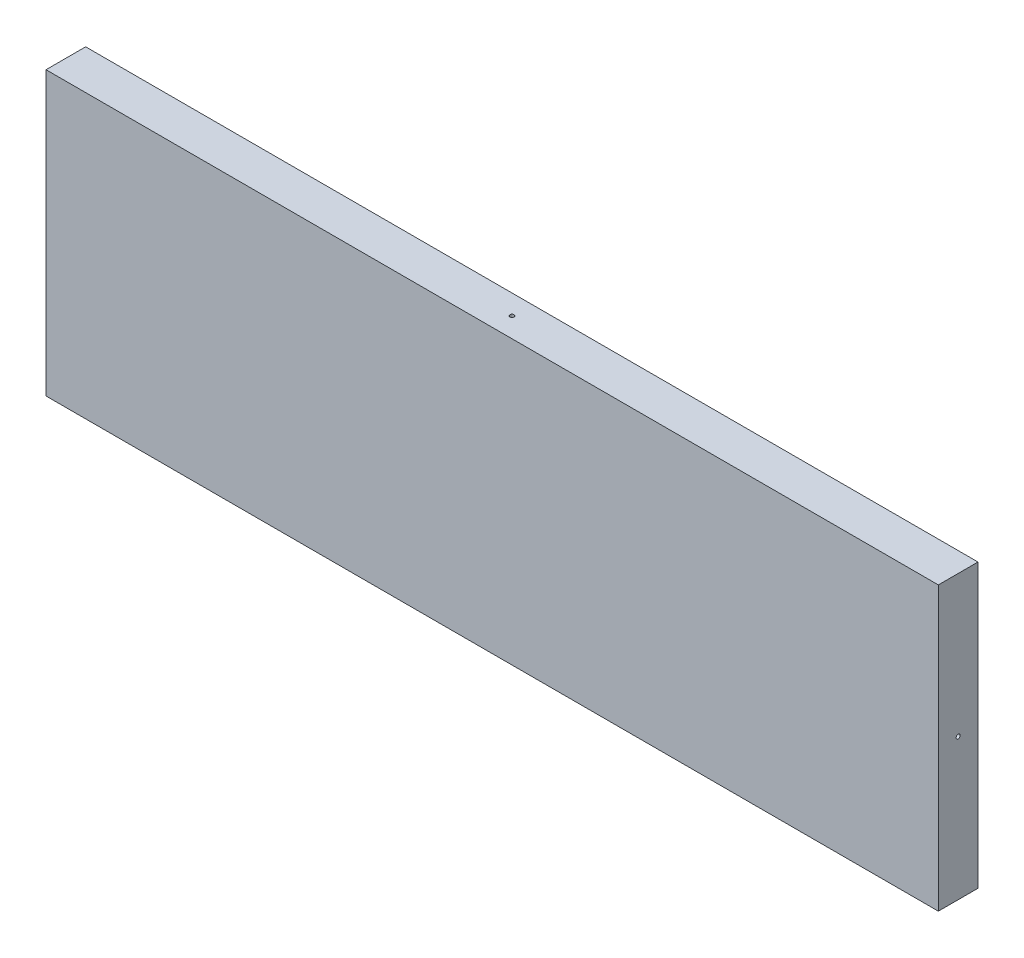
ISO-10303-21;
HEADER;
FILE_DESCRIPTION(('STEP AP214'),'2;1');
FILE_NAME('part.step','',(''),(''),'','','');
FILE_SCHEMA(('AUTOMOTIVE_DESIGN { 1 0 10303 214 1 1 1 1 }'));
ENDSEC;
DATA;
#1=APPLICATION_CONTEXT('core data for automotive mechanical design processes');
#2=APPLICATION_PROTOCOL_DEFINITION('international standard','automotive_design',2000,#1);
#3=PRODUCT_CONTEXT('',#1,'mechanical');
#4=PRODUCT('Part','Part','',(#3));
#5=PRODUCT_RELATED_PRODUCT_CATEGORY('part','',(#4));
#6=PRODUCT_DEFINITION_FORMATION('','',#4);
#7=PRODUCT_DEFINITION_CONTEXT('part definition',#1,'design');
#8=PRODUCT_DEFINITION('design','',#6,#7);
#9=PRODUCT_DEFINITION_SHAPE('','',#8);
#10=(LENGTH_UNIT() NAMED_UNIT(*) SI_UNIT(.MILLI.,.METRE.));
#11=(NAMED_UNIT(*) PLANE_ANGLE_UNIT() SI_UNIT($,.RADIAN.));
#12=(NAMED_UNIT(*) SI_UNIT($,.STERADIAN.) SOLID_ANGLE_UNIT());
#13=UNCERTAINTY_MEASURE_WITH_UNIT(LENGTH_MEASURE(1.E-05),#10,'distance_accuracy_value','');
#14=(GEOMETRIC_REPRESENTATION_CONTEXT(3) GLOBAL_UNCERTAINTY_ASSIGNED_CONTEXT((#13)) GLOBAL_UNIT_ASSIGNED_CONTEXT((#10,
#11,#12)) REPRESENTATION_CONTEXT('',''));
#15=CARTESIAN_POINT('',(0.,0.,0.));
#16=DIRECTION('',(0.,0.,1.));
#17=DIRECTION('',(1.,0.,0.));
#18=AXIS2_PLACEMENT_3D('',#15,#16,#17);
#19=CARTESIAN_POINT('',(0.,142.5,20.));
#20=DIRECTION('',(0.,1.,0.));
#21=DIRECTION('',(0.,0.,1.));
#22=AXIS2_PLACEMENT_3D('',#19,#20,#21);
#23=CYLINDRICAL_SURFACE('',#22,2.09999999999998);
#24=CARTESIAN_POINT('',(0.,142.5,20.));
#25=DIRECTION('',(0.,1.,0.));
#26=DIRECTION('',(0.,0.,1.));
#27=AXIS2_PLACEMENT_3D('',#24,#25,#26);
#28=CIRCLE('',#27,2.09999999999999);
#29=CARTESIAN_POINT('',(0.,142.5,22.1));
#30=VERTEX_POINT('',#29);
#31=EDGE_CURVE('E156',#30,#30,#28,.T.);
#32=ORIENTED_EDGE('',*,*,#31,.T.);
#33=EDGE_LOOP('',(#32));
#34=FACE_BOUND('',#33,.T.);
#35=CARTESIAN_POINT('',(0.,0.,20.));
#36=DIRECTION('',(0.707106781186547,0.707106781186547,0.));
#37=DIRECTION('',(-0.707106781186547,0.707106781186547,0.));
#38=AXIS2_PLACEMENT_3D('',#35,#36,#37);
#39=ELLIPSE('',#38,2.96984848098344,2.09999999999996);
#40=CARTESIAN_POINT('',(0.,0.,22.1));
#41=VERTEX_POINT('',#40);
#42=CARTESIAN_POINT('',(0.,0.,17.9));
#43=VERTEX_POINT('',#42);
#44=EDGE_CURVE('E59',#41,#43,#39,.F.);
#45=ORIENTED_EDGE('',*,*,#44,.T.);
#46=CARTESIAN_POINT('',(0.,0.,20.));
#47=DIRECTION('',(-0.707106781186547,0.707106781186547,0.));
#48=DIRECTION('',(0.707106781186547,0.707106781186547,0.));
#49=AXIS2_PLACEMENT_3D('',#46,#47,#48);
#50=ELLIPSE('',#49,2.96984848098344,2.09999999999996);
#51=EDGE_CURVE('E11',#43,#41,#50,.F.);
#52=ORIENTED_EDGE('',*,*,#51,.T.);
#53=EDGE_LOOP('',(#45,#52));
#54=FACE_BOUND('',#53,.T.);
#55=ADVANCED_FACE('F45',(#34,#54),#23,.F.);
#56=CARTESIAN_POINT('',(450.,142.5,40.));
#57=DIRECTION('',(-1.,0.,0.));
#58=DIRECTION('',(0.,-1.,0.));
#59=AXIS2_PLACEMENT_3D('',#56,#57,#58);
#60=PLANE('',#59);
#61=CARTESIAN_POINT('',(450.,0.,20.));
#62=DIRECTION('',(-1.,0.,0.));
#63=DIRECTION('',(0.,0.,1.));
#64=AXIS2_PLACEMENT_3D('',#61,#62,#63);
#65=CIRCLE('',#64,2.09999999999989);
#66=CARTESIAN_POINT('',(450.,0.,22.0999999999999));
#67=VERTEX_POINT('',#66);
#68=EDGE_CURVE('E160',#67,#67,#65,.T.);
#69=ORIENTED_EDGE('',*,*,#68,.T.);
#70=EDGE_LOOP('',(#69));
#71=FACE_BOUND('',#70,.T.);
#72=DIRECTION('',(0.,1.,0.));
#73=VECTOR('',#72,1.);
#74=CARTESIAN_POINT('',(450.,142.5,0.));
#75=LINE('',#74,#73);
#76=CARTESIAN_POINT('',(450.,-142.5,0.));
#77=VERTEX_POINT('',#76);
#78=CARTESIAN_POINT('',(450.,142.5,0.));
#79=VERTEX_POINT('',#78);
#80=EDGE_CURVE('E139',#77,#79,#75,.T.);
#81=ORIENTED_EDGE('',*,*,#80,.T.);
#82=DIRECTION('',(0.,0.,-1.));
#83=VECTOR('',#82,1.);
#84=CARTESIAN_POINT('',(450.,142.5,40.));
#85=LINE('',#84,#83);
#86=CARTESIAN_POINT('',(450.,142.5,40.));
#87=VERTEX_POINT('',#86);
#88=EDGE_CURVE('E112',#87,#79,#85,.T.);
#89=ORIENTED_EDGE('',*,*,#88,.F.);
#90=DIRECTION('',(0.,1.,0.));
#91=VECTOR('',#90,1.);
#92=CARTESIAN_POINT('',(450.,142.5,40.));
#93=LINE('',#92,#91);
#94=CARTESIAN_POINT('',(450.,-142.5,40.));
#95=VERTEX_POINT('',#94);
#96=EDGE_CURVE('E132',#95,#87,#93,.T.);
#97=ORIENTED_EDGE('',*,*,#96,.F.);
#98=DIRECTION('',(0.,0.,-1.));
#99=VECTOR('',#98,1.);
#100=CARTESIAN_POINT('',(450.,-142.5,40.));
#101=LINE('',#100,#99);
#102=EDGE_CURVE('E127',#95,#77,#101,.T.);
#103=ORIENTED_EDGE('',*,*,#102,.T.);
#104=EDGE_LOOP('',(#81,#89,#97,#103));
#105=FACE_BOUND('',#104,.T.);
#106=ADVANCED_FACE('F47',(#71,#105),#60,.F.);
#107=CARTESIAN_POINT('',(-450.,142.5,40.));
#108=DIRECTION('',(0.,-1.,0.));
#109=DIRECTION('',(0.,0.,-1.));
#110=AXIS2_PLACEMENT_3D('',#107,#108,#109);
#111=PLANE('',#110);
#112=ORIENTED_EDGE('',*,*,#31,.F.);
#113=EDGE_LOOP('',(#112));
#114=FACE_BOUND('',#113,.T.);
#115=DIRECTION('',(-1.,0.,0.));
#116=VECTOR('',#115,1.);
#117=CARTESIAN_POINT('',(-450.,142.5,0.));
#118=LINE('',#117,#116);
#119=CARTESIAN_POINT('',(-450.,142.5,0.));
#120=VERTEX_POINT('',#119);
#121=EDGE_CURVE('E136',#79,#120,#118,.T.);
#122=ORIENTED_EDGE('',*,*,#121,.T.);
#123=DIRECTION('',(0.,0.,-1.));
#124=VECTOR('',#123,1.);
#125=CARTESIAN_POINT('',(-450.,142.5,40.));
#126=LINE('',#125,#124);
#127=CARTESIAN_POINT('',(-450.,142.5,40.));
#128=VERTEX_POINT('',#127);
#129=EDGE_CURVE('E120',#128,#120,#126,.T.);
#130=ORIENTED_EDGE('',*,*,#129,.F.);
#131=DIRECTION('',(-1.,0.,0.));
#132=VECTOR('',#131,1.);
#133=CARTESIAN_POINT('',(-450.,142.5,40.));
#134=LINE('',#133,#132);
#135=EDGE_CURVE('E97',#87,#128,#134,.T.);
#136=ORIENTED_EDGE('',*,*,#135,.F.);
#137=ORIENTED_EDGE('',*,*,#88,.T.);
#138=EDGE_LOOP('',(#122,#130,#136,#137));
#139=FACE_BOUND('',#138,.T.);
#140=ADVANCED_FACE('F174',(#114,#139),#111,.F.);
#141=CARTESIAN_POINT('',(-450.,142.5,40.));
#142=DIRECTION('',(1.,0.,0.));
#143=DIRECTION('',(0.,1.,0.));
#144=AXIS2_PLACEMENT_3D('',#141,#142,#143);
#145=PLANE('',#144);
#146=CARTESIAN_POINT('',(-450.,0.,20.));
#147=DIRECTION('',(-1.,0.,0.));
#148=DIRECTION('',(0.,0.,1.));
#149=AXIS2_PLACEMENT_3D('',#146,#147,#148);
#150=CIRCLE('',#149,2.09999999999999);
#151=CARTESIAN_POINT('',(-450.,0.,22.1));
#152=VERTEX_POINT('',#151);
#153=EDGE_CURVE('E164',#152,#152,#150,.T.);
#154=ORIENTED_EDGE('',*,*,#153,.F.);
#155=EDGE_LOOP('',(#154));
#156=FACE_BOUND('',#155,.T.);
#157=DIRECTION('',(0.,-1.,0.));
#158=VECTOR('',#157,1.);
#159=CARTESIAN_POINT('',(-450.,142.5,0.));
#160=LINE('',#159,#158);
#161=CARTESIAN_POINT('',(-450.,-142.5,0.));
#162=VERTEX_POINT('',#161);
#163=EDGE_CURVE('E133',#120,#162,#160,.T.);
#164=ORIENTED_EDGE('',*,*,#163,.T.);
#165=DIRECTION('',(0.,0.,-1.));
#166=VECTOR('',#165,1.);
#167=CARTESIAN_POINT('',(-450.,-142.5,40.));
#168=LINE('',#167,#166);
#169=CARTESIAN_POINT('',(-450.,-142.5,40.));
#170=VERTEX_POINT('',#169);
#171=EDGE_CURVE('E124',#170,#162,#168,.T.);
#172=ORIENTED_EDGE('',*,*,#171,.F.);
#173=DIRECTION('',(0.,-1.,0.));
#174=VECTOR('',#173,1.);
#175=CARTESIAN_POINT('',(-450.,142.5,40.));
#176=LINE('',#175,#174);
#177=EDGE_CURVE('E146',#128,#170,#176,.T.);
#178=ORIENTED_EDGE('',*,*,#177,.F.);
#179=ORIENTED_EDGE('',*,*,#129,.T.);
#180=EDGE_LOOP('',(#164,#172,#178,#179));
#181=FACE_BOUND('',#180,.T.);
#182=ADVANCED_FACE('F170',(#156,#181),#145,.F.);
#183=CARTESIAN_POINT('',(-450.,-142.5,40.));
#184=DIRECTION('',(0.,1.,0.));
#185=DIRECTION('',(0.,0.,1.));
#186=AXIS2_PLACEMENT_3D('',#183,#184,#185);
#187=PLANE('',#186);
#188=CARTESIAN_POINT('',(0.,-142.5,20.));
#189=DIRECTION('',(0.,1.,0.));
#190=DIRECTION('',(0.,0.,1.));
#191=AXIS2_PLACEMENT_3D('',#188,#189,#190);
#192=CIRCLE('',#191,2.09999999999996);
#193=CARTESIAN_POINT('',(0.,-142.5,22.1));
#194=VERTEX_POINT('',#193);
#195=EDGE_CURVE('E143',#194,#194,#192,.T.);
#196=ORIENTED_EDGE('',*,*,#195,.T.);
#197=EDGE_LOOP('',(#196));
#198=FACE_BOUND('',#197,.T.);
#199=DIRECTION('',(1.,0.,0.));
#200=VECTOR('',#199,1.);
#201=CARTESIAN_POINT('',(-450.,-142.5,0.));
#202=LINE('',#201,#200);
#203=EDGE_CURVE('E89',#162,#77,#202,.T.);
#204=ORIENTED_EDGE('',*,*,#203,.T.);
#205=ORIENTED_EDGE('',*,*,#102,.F.);
#206=DIRECTION('',(1.,0.,0.));
#207=VECTOR('',#206,1.);
#208=CARTESIAN_POINT('',(-450.,-142.5,40.));
#209=LINE('',#208,#207);
#210=EDGE_CURVE('E68',#170,#95,#209,.T.);
#211=ORIENTED_EDGE('',*,*,#210,.F.);
#212=ORIENTED_EDGE('',*,*,#171,.T.);
#213=EDGE_LOOP('',(#204,#205,#211,#212));
#214=FACE_BOUND('',#213,.T.);
#215=ADVANCED_FACE('F173',(#198,#214),#187,.F.);
#216=CARTESIAN_POINT('',(0.,0.,40.));
#217=DIRECTION('',(0.,0.,1.));
#218=DIRECTION('',(1.,0.,0.));
#219=AXIS2_PLACEMENT_3D('',#216,#217,#218);
#220=PLANE('',#219);
#221=ORIENTED_EDGE('',*,*,#96,.T.);
#222=ORIENTED_EDGE('',*,*,#135,.T.);
#223=ORIENTED_EDGE('',*,*,#177,.T.);
#224=ORIENTED_EDGE('',*,*,#210,.T.);
#225=EDGE_LOOP('',(#221,#222,#223,#224));
#226=FACE_BOUND('',#225,.T.);
#227=ADVANCED_FACE('F185',(#226),#220,.T.);
#228=CARTESIAN_POINT('',(0.,0.,0.));
#229=DIRECTION('',(0.,0.,1.));
#230=DIRECTION('',(1.,0.,0.));
#231=AXIS2_PLACEMENT_3D('',#228,#229,#230);
#232=PLANE('',#231);
#233=ORIENTED_EDGE('',*,*,#80,.F.);
#234=ORIENTED_EDGE('',*,*,#203,.F.);
#235=ORIENTED_EDGE('',*,*,#163,.F.);
#236=ORIENTED_EDGE('',*,*,#121,.F.);
#237=EDGE_LOOP('',(#233,#234,#235,#236));
#238=FACE_BOUND('',#237,.T.);
#239=ADVANCED_FACE('F181',(#238),#232,.F.);
#240=CARTESIAN_POINT('',(0.,0.,20.));
#241=DIRECTION('',(0.707106781186547,0.707106781186547,0.));
#242=DIRECTION('',(-0.707106781186547,0.707106781186547,0.));
#243=AXIS2_PLACEMENT_3D('',#240,#241,#242);
#244=ELLIPSE('',#243,2.96984848098344,2.09999999999996);
#245=EDGE_CURVE('E103',#41,#43,#244,.T.);
#246=ORIENTED_EDGE('',*,*,#245,.T.);
#247=CARTESIAN_POINT('',(0.,0.,20.));
#248=DIRECTION('',(-0.707106781186547,0.707106781186547,0.));
#249=DIRECTION('',(0.707106781186547,0.707106781186547,0.));
#250=AXIS2_PLACEMENT_3D('',#247,#248,#249);
#251=ELLIPSE('',#250,2.96984848098344,2.09999999999996);
#252=EDGE_CURVE('E54',#43,#41,#251,.T.);
#253=ORIENTED_EDGE('',*,*,#252,.T.);
#254=EDGE_LOOP('',(#246,#253));
#255=FACE_BOUND('',#254,.T.);
#256=ORIENTED_EDGE('',*,*,#195,.F.);
#257=EDGE_LOOP('',(#256));
#258=FACE_BOUND('',#257,.T.);
#259=ADVANCED_FACE('F114',(#255,#258),#23,.F.);
#260=CARTESIAN_POINT('',(-450.,0.,20.));
#261=DIRECTION('',(-1.,0.,0.));
#262=DIRECTION('',(0.,0.,1.));
#263=AXIS2_PLACEMENT_3D('',#260,#261,#262);
#264=CYLINDRICAL_SURFACE('',#263,2.09999999999994);
#265=ORIENTED_EDGE('',*,*,#153,.T.);
#266=EDGE_LOOP('',(#265));
#267=FACE_BOUND('',#266,.T.);
#268=ORIENTED_EDGE('',*,*,#44,.F.);
#269=ORIENTED_EDGE('',*,*,#252,.F.);
#270=EDGE_LOOP('',(#268,#269));
#271=FACE_BOUND('',#270,.T.);
#272=ADVANCED_FACE('F110',(#267,#271),#264,.F.);
#273=ORIENTED_EDGE('',*,*,#68,.F.);
#274=EDGE_LOOP('',(#273));
#275=FACE_BOUND('',#274,.T.);
#276=ORIENTED_EDGE('',*,*,#245,.F.);
#277=ORIENTED_EDGE('',*,*,#51,.F.);
#278=EDGE_LOOP('',(#276,#277));
#279=FACE_BOUND('',#278,.T.);
#280=ADVANCED_FACE('F104',(#275,#279),#264,.F.);
#281=CLOSED_SHELL('',(#55,#106,#140,#182,#215,#227,#239,#259,#272,#280));
#282=MANIFOLD_SOLID_BREP('B2',#281);
#283=ADVANCED_BREP_SHAPE_REPRESENTATION('',(#18,#282),#14);
#284=SHAPE_DEFINITION_REPRESENTATION(#9,#283);
ENDSEC;
END-ISO-10303-21;
